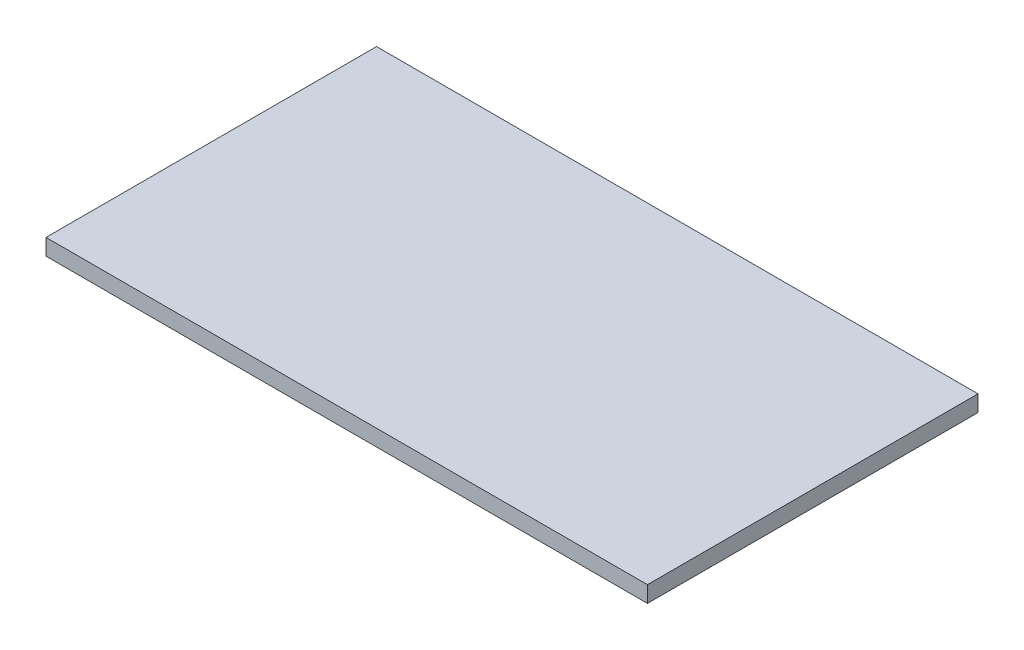
ISO-10303-21;
HEADER;
FILE_DESCRIPTION(('STEP AP214'),'2;1');
FILE_NAME('part.step','',(''),(''),'','','');
FILE_SCHEMA(('AUTOMOTIVE_DESIGN { 1 0 10303 214 1 1 1 1 }'));
ENDSEC;
DATA;
#1=APPLICATION_CONTEXT('core data for automotive mechanical design processes');
#2=APPLICATION_PROTOCOL_DEFINITION('international standard','automotive_design',2000,#1);
#3=PRODUCT_CONTEXT('',#1,'mechanical');
#4=PRODUCT('Part','Part','',(#3));
#5=PRODUCT_RELATED_PRODUCT_CATEGORY('part','',(#4));
#6=PRODUCT_DEFINITION_FORMATION('','',#4);
#7=PRODUCT_DEFINITION_CONTEXT('part definition',#1,'design');
#8=PRODUCT_DEFINITION('design','',#6,#7);
#9=PRODUCT_DEFINITION_SHAPE('','',#8);
#10=(LENGTH_UNIT() NAMED_UNIT(*) SI_UNIT(.MILLI.,.METRE.));
#11=(NAMED_UNIT(*) PLANE_ANGLE_UNIT() SI_UNIT($,.RADIAN.));
#12=(NAMED_UNIT(*) SI_UNIT($,.STERADIAN.) SOLID_ANGLE_UNIT());
#13=UNCERTAINTY_MEASURE_WITH_UNIT(LENGTH_MEASURE(1.E-05),#10,'distance_accuracy_value','');
#14=(GEOMETRIC_REPRESENTATION_CONTEXT(3) GLOBAL_UNCERTAINTY_ASSIGNED_CONTEXT((#13)) GLOBAL_UNIT_ASSIGNED_CONTEXT((#10,
#11,#12)) REPRESENTATION_CONTEXT('',''));
#15=CARTESIAN_POINT('',(0.,0.,0.));
#16=DIRECTION('',(0.,0.,1.));
#17=DIRECTION('',(1.,0.,0.));
#18=AXIS2_PLACEMENT_3D('',#15,#16,#17);
#19=CARTESIAN_POINT('',(-50.3612849946578,3.,-28.5058649589905));
#20=DIRECTION('',(1.,0.,0.));
#21=DIRECTION('',(0.,0.,-1.));
#22=AXIS2_PLACEMENT_3D('',#19,#20,#21);
#23=PLANE('',#22);
#24=DIRECTION('',(0.,0.,1.));
#25=VECTOR('',#24,1.);
#26=CARTESIAN_POINT('',(-50.3612849946578,0.,-28.5058649589905));
#27=LINE('',#26,#25);
#28=CARTESIAN_POINT('',(-50.3612849946578,0.,-28.5058649589905));
#29=VERTEX_POINT('',#28);
#30=CARTESIAN_POINT('',(-50.3612849946578,0.,32.4941350410095));
#31=VERTEX_POINT('',#30);
#32=EDGE_CURVE('E107',#29,#31,#27,.T.);
#33=ORIENTED_EDGE('',*,*,#32,.T.);
#34=DIRECTION('',(0.,-1.,0.));
#35=VECTOR('',#34,1.);
#36=CARTESIAN_POINT('',(-50.3612849946578,3.,32.4941350410095));
#37=LINE('',#36,#35);
#38=CARTESIAN_POINT('',(-50.3612849946578,3.,32.4941350410095));
#39=VERTEX_POINT('',#38);
#40=EDGE_CURVE('E11',#39,#31,#37,.T.);
#41=ORIENTED_EDGE('',*,*,#40,.F.);
#42=DIRECTION('',(0.,0.,1.));
#43=VECTOR('',#42,1.);
#44=CARTESIAN_POINT('',(-50.3612849946578,3.,-28.5058649589905));
#45=LINE('',#44,#43);
#46=CARTESIAN_POINT('',(-50.3612849946578,3.,-28.5058649589905));
#47=VERTEX_POINT('',#46);
#48=EDGE_CURVE('E91',#47,#39,#45,.T.);
#49=ORIENTED_EDGE('',*,*,#48,.F.);
#50=DIRECTION('',(0.,-1.,0.));
#51=VECTOR('',#50,1.);
#52=CARTESIAN_POINT('',(-50.3612849946578,3.,-28.5058649589905));
#53=LINE('',#52,#51);
#54=EDGE_CURVE('E103',#47,#29,#53,.T.);
#55=ORIENTED_EDGE('',*,*,#54,.T.);
#56=EDGE_LOOP('',(#33,#41,#49,#55));
#57=FACE_BOUND('',#56,.T.);
#58=ADVANCED_FACE('F39',(#57),#23,.F.);
#59=CARTESIAN_POINT('',(-50.3612849946578,3.,32.4941350410095));
#60=DIRECTION('',(0.,0.,-1.));
#61=DIRECTION('',(-1.,0.,0.));
#62=AXIS2_PLACEMENT_3D('',#59,#60,#61);
#63=PLANE('',#62);
#64=DIRECTION('',(1.,0.,0.));
#65=VECTOR('',#64,1.);
#66=CARTESIAN_POINT('',(-50.3612849946578,0.,32.4941350410095));
#67=LINE('',#66,#65);
#68=CARTESIAN_POINT('',(60.6387150053422,0.,32.4941350410095));
#69=VERTEX_POINT('',#68);
#70=EDGE_CURVE('E96',#31,#69,#67,.T.);
#71=ORIENTED_EDGE('',*,*,#70,.T.);
#72=DIRECTION('',(0.,-1.,0.));
#73=VECTOR('',#72,1.);
#74=CARTESIAN_POINT('',(60.6387150053422,3.,32.4941350410095));
#75=LINE('',#74,#73);
#76=CARTESIAN_POINT('',(60.6387150053422,3.,32.4941350410095));
#77=VERTEX_POINT('',#76);
#78=EDGE_CURVE('E48',#77,#69,#75,.T.);
#79=ORIENTED_EDGE('',*,*,#78,.F.);
#80=DIRECTION('',(1.,0.,0.));
#81=VECTOR('',#80,1.);
#82=CARTESIAN_POINT('',(-50.3612849946578,3.,32.4941350410095));
#83=LINE('',#82,#81);
#84=EDGE_CURVE('E86',#39,#77,#83,.T.);
#85=ORIENTED_EDGE('',*,*,#84,.F.);
#86=ORIENTED_EDGE('',*,*,#40,.T.);
#87=EDGE_LOOP('',(#71,#79,#85,#86));
#88=FACE_BOUND('',#87,.T.);
#89=ADVANCED_FACE('F95',(#88),#63,.F.);
#90=CARTESIAN_POINT('',(60.6387150053422,3.,-28.5058649589905));
#91=DIRECTION('',(-1.,0.,0.));
#92=DIRECTION('',(0.,0.,1.));
#93=AXIS2_PLACEMENT_3D('',#90,#91,#92);
#94=PLANE('',#93);
#95=DIRECTION('',(0.,0.,-1.));
#96=VECTOR('',#95,1.);
#97=CARTESIAN_POINT('',(60.6387150053422,0.,-28.5058649589905));
#98=LINE('',#97,#96);
#99=CARTESIAN_POINT('',(60.6387150053422,0.,-28.5058649589905));
#100=VERTEX_POINT('',#99);
#101=EDGE_CURVE('E73',#69,#100,#98,.T.);
#102=ORIENTED_EDGE('',*,*,#101,.T.);
#103=DIRECTION('',(0.,-1.,0.));
#104=VECTOR('',#103,1.);
#105=CARTESIAN_POINT('',(60.6387150053422,3.,-28.5058649589905));
#106=LINE('',#105,#104);
#107=CARTESIAN_POINT('',(60.6387150053422,3.,-28.5058649589905));
#108=VERTEX_POINT('',#107);
#109=EDGE_CURVE('E98',#108,#100,#106,.T.);
#110=ORIENTED_EDGE('',*,*,#109,.F.);
#111=DIRECTION('',(0.,0.,-1.));
#112=VECTOR('',#111,1.);
#113=CARTESIAN_POINT('',(60.6387150053422,3.,-28.5058649589905));
#114=LINE('',#113,#112);
#115=EDGE_CURVE('E89',#77,#108,#114,.T.);
#116=ORIENTED_EDGE('',*,*,#115,.F.);
#117=ORIENTED_EDGE('',*,*,#78,.T.);
#118=EDGE_LOOP('',(#102,#110,#116,#117));
#119=FACE_BOUND('',#118,.T.);
#120=ADVANCED_FACE('F99',(#119),#94,.F.);
#121=CARTESIAN_POINT('',(-50.3612849946578,3.,-28.5058649589905));
#122=DIRECTION('',(0.,0.,1.));
#123=DIRECTION('',(1.,0.,0.));
#124=AXIS2_PLACEMENT_3D('',#121,#122,#123);
#125=PLANE('',#124);
#126=DIRECTION('',(-1.,0.,0.));
#127=VECTOR('',#126,1.);
#128=CARTESIAN_POINT('',(-50.3612849946578,0.,-28.5058649589905));
#129=LINE('',#128,#127);
#130=EDGE_CURVE('E79',#100,#29,#129,.T.);
#131=ORIENTED_EDGE('',*,*,#130,.T.);
#132=ORIENTED_EDGE('',*,*,#54,.F.);
#133=DIRECTION('',(-1.,0.,0.));
#134=VECTOR('',#133,1.);
#135=CARTESIAN_POINT('',(-50.3612849946578,3.,-28.5058649589905));
#136=LINE('',#135,#134);
#137=EDGE_CURVE('E56',#108,#47,#136,.T.);
#138=ORIENTED_EDGE('',*,*,#137,.F.);
#139=ORIENTED_EDGE('',*,*,#109,.T.);
#140=EDGE_LOOP('',(#131,#132,#138,#139));
#141=FACE_BOUND('',#140,.T.);
#142=ADVANCED_FACE('F120',(#141),#125,.F.);
#143=CARTESIAN_POINT('',(0.,3.,0.));
#144=DIRECTION('',(0.,1.,0.));
#145=DIRECTION('',(0.,0.,1.));
#146=AXIS2_PLACEMENT_3D('',#143,#144,#145);
#147=PLANE('',#146);
#148=ORIENTED_EDGE('',*,*,#48,.T.);
#149=ORIENTED_EDGE('',*,*,#84,.T.);
#150=ORIENTED_EDGE('',*,*,#115,.T.);
#151=ORIENTED_EDGE('',*,*,#137,.T.);
#152=EDGE_LOOP('',(#148,#149,#150,#151));
#153=FACE_BOUND('',#152,.T.);
#154=ADVANCED_FACE('F87',(#153),#147,.T.);
#155=CARTESIAN_POINT('',(0.,0.,0.));
#156=DIRECTION('',(0.,1.,0.));
#157=DIRECTION('',(0.,0.,1.));
#158=AXIS2_PLACEMENT_3D('',#155,#156,#157);
#159=PLANE('',#158);
#160=ORIENTED_EDGE('',*,*,#32,.F.);
#161=ORIENTED_EDGE('',*,*,#130,.F.);
#162=ORIENTED_EDGE('',*,*,#101,.F.);
#163=ORIENTED_EDGE('',*,*,#70,.F.);
#164=EDGE_LOOP('',(#160,#161,#162,#163));
#165=FACE_BOUND('',#164,.T.);
#166=ADVANCED_FACE('F123',(#165),#159,.F.);
#167=CLOSED_SHELL('',(#58,#89,#120,#142,#154,#166));
#168=MANIFOLD_SOLID_BREP('B2',#167);
#169=ADVANCED_BREP_SHAPE_REPRESENTATION('',(#18,#168),#14);
#170=SHAPE_DEFINITION_REPRESENTATION(#9,#169);
ENDSEC;
END-ISO-10303-21;
